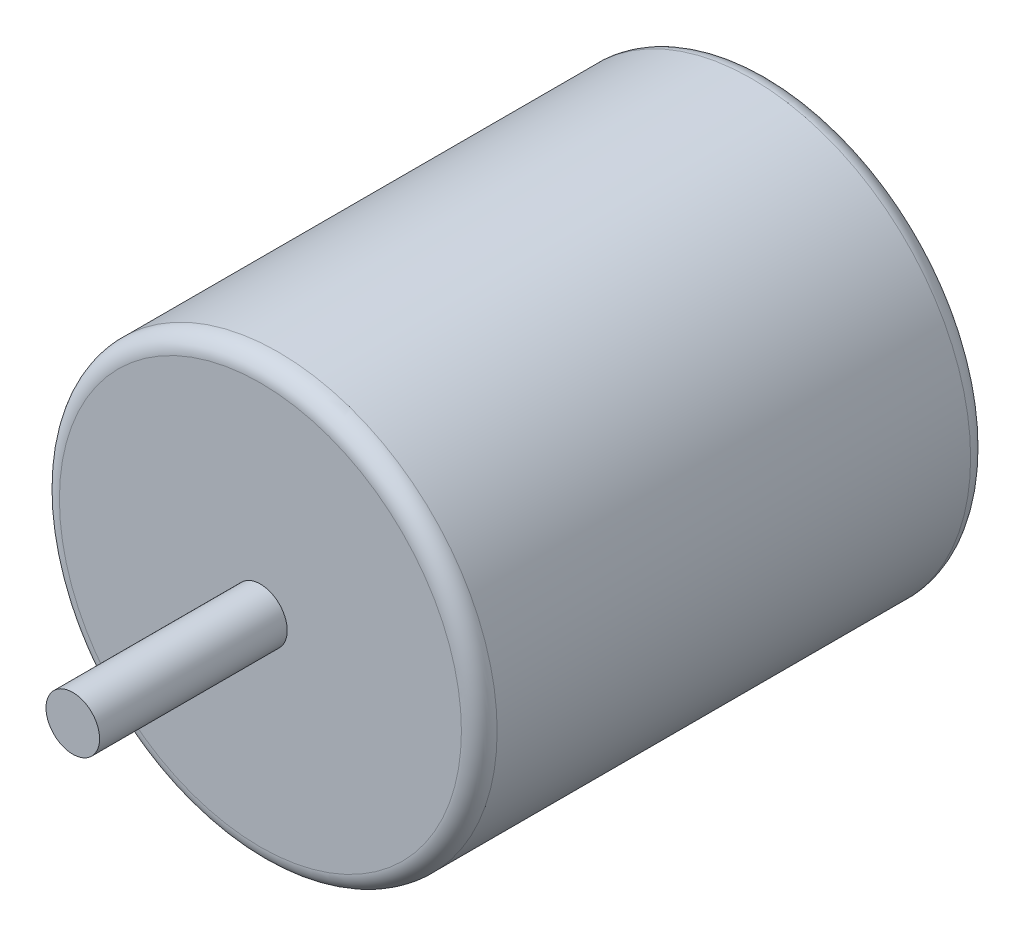
ISO-10303-21;
HEADER;
FILE_DESCRIPTION(('STEP AP214'),'2;1');
FILE_NAME('part.step','',(''),(''),'','','');
FILE_SCHEMA(('AUTOMOTIVE_DESIGN { 1 0 10303 214 1 1 1 1 }'));
ENDSEC;
DATA;
#1=APPLICATION_CONTEXT('core data for automotive mechanical design processes');
#2=APPLICATION_PROTOCOL_DEFINITION('international standard','automotive_design',2000,#1);
#3=PRODUCT_CONTEXT('',#1,'mechanical');
#4=PRODUCT('Part','Part','',(#3));
#5=PRODUCT_RELATED_PRODUCT_CATEGORY('part','',(#4));
#6=PRODUCT_DEFINITION_FORMATION('','',#4);
#7=PRODUCT_DEFINITION_CONTEXT('part definition',#1,'design');
#8=PRODUCT_DEFINITION('design','',#6,#7);
#9=PRODUCT_DEFINITION_SHAPE('','',#8);
#10=(LENGTH_UNIT() NAMED_UNIT(*) SI_UNIT(.MILLI.,.METRE.));
#11=(NAMED_UNIT(*) PLANE_ANGLE_UNIT() SI_UNIT($,.RADIAN.));
#12=(NAMED_UNIT(*) SI_UNIT($,.STERADIAN.) SOLID_ANGLE_UNIT());
#13=UNCERTAINTY_MEASURE_WITH_UNIT(LENGTH_MEASURE(1.E-05),#10,'distance_accuracy_value','');
#14=(GEOMETRIC_REPRESENTATION_CONTEXT(3) GLOBAL_UNCERTAINTY_ASSIGNED_CONTEXT((#13)) GLOBAL_UNIT_ASSIGNED_CONTEXT((#10,
#11,#12)) REPRESENTATION_CONTEXT('',''));
#15=CARTESIAN_POINT('',(0.,0.,0.));
#16=DIRECTION('',(0.,0.,1.));
#17=DIRECTION('',(1.,0.,0.));
#18=AXIS2_PLACEMENT_3D('',#15,#16,#17);
#19=CARTESIAN_POINT('',(0.,0.,57.));
#20=DIRECTION('',(0.,0.,-1.));
#21=DIRECTION('',(-1.,0.,0.));
#22=AXIS2_PLACEMENT_3D('',#19,#20,#21);
#23=CYLINDRICAL_SURFACE('',#22,24.5);
#24=CARTESIAN_POINT('',(0.,0.,55.));
#25=DIRECTION('',(0.,0.,1.));
#26=DIRECTION('',(1.,0.,0.));
#27=AXIS2_PLACEMENT_3D('',#24,#25,#26);
#28=CIRCLE('',#27,24.5);
#29=CARTESIAN_POINT('',(-24.5,0.,55.));
#30=VERTEX_POINT('',#29);
#31=EDGE_CURVE('E38',#30,#30,#28,.F.);
#32=CARTESIAN_POINT('',(0.,0.,2.));
#33=DIRECTION('',(0.,0.,1.));
#34=DIRECTION('',(1.,0.,0.));
#35=AXIS2_PLACEMENT_3D('',#32,#33,#34);
#36=CIRCLE('',#35,24.5);
#37=CARTESIAN_POINT('',(-24.5,0.,2.));
#38=VERTEX_POINT('',#37);
#39=EDGE_CURVE('E42',#38,#38,#36,.T.);
#40=CARTESIAN_POINT('',(-24.5,0.,55.));
#41=CARTESIAN_POINT('',(-24.5,0.,54.4479166666667));
#42=CARTESIAN_POINT('',(-24.5,0.,53.8958333333333));
#43=CARTESIAN_POINT('',(-24.5,0.,52.7916666666667));
#44=CARTESIAN_POINT('',(-24.5,0.,52.2395833333333));
#45=CARTESIAN_POINT('',(-24.5,0.,51.1354166666667));
#46=CARTESIAN_POINT('',(-24.5,0.,50.5833333333333));
#47=CARTESIAN_POINT('',(-24.5,0.,49.4791666666667));
#48=CARTESIAN_POINT('',(-24.5,0.,48.9270833333333));
#49=CARTESIAN_POINT('',(-24.5,0.,47.8229166666667));
#50=CARTESIAN_POINT('',(-24.5,0.,47.2708333333333));
#51=CARTESIAN_POINT('',(-24.5,0.,46.1666666666667));
#52=CARTESIAN_POINT('',(-24.5,0.,45.6145833333333));
#53=CARTESIAN_POINT('',(-24.5,0.,44.5104166666667));
#54=CARTESIAN_POINT('',(-24.5,0.,43.9583333333333));
#55=CARTESIAN_POINT('',(-24.5,0.,42.8541666666667));
#56=CARTESIAN_POINT('',(-24.5,0.,42.3020833333333));
#57=CARTESIAN_POINT('',(-24.5,0.,41.1979166666667));
#58=CARTESIAN_POINT('',(-24.5,0.,40.6458333333333));
#59=CARTESIAN_POINT('',(-24.5,0.,39.5416666666667));
#60=CARTESIAN_POINT('',(-24.5,0.,38.9895833333333));
#61=CARTESIAN_POINT('',(-24.5,0.,37.8854166666667));
#62=CARTESIAN_POINT('',(-24.5,0.,37.3333333333333));
#63=CARTESIAN_POINT('',(-24.5,0.,36.2291666666667));
#64=CARTESIAN_POINT('',(-24.5,0.,35.6770833333333));
#65=CARTESIAN_POINT('',(-24.5,0.,34.5729166666667));
#66=CARTESIAN_POINT('',(-24.5,0.,34.0208333333333));
#67=CARTESIAN_POINT('',(-24.5,0.,32.9166666666667));
#68=CARTESIAN_POINT('',(-24.5,0.,32.3645833333333));
#69=CARTESIAN_POINT('',(-24.5,0.,31.2604166666667));
#70=CARTESIAN_POINT('',(-24.5,0.,30.7083333333333));
#71=CARTESIAN_POINT('',(-24.5,0.,29.6041666666667));
#72=CARTESIAN_POINT('',(-24.5,0.,29.0520833333333));
#73=CARTESIAN_POINT('',(-24.5,0.,27.9479166666667));
#74=CARTESIAN_POINT('',(-24.5,0.,27.3958333333333));
#75=CARTESIAN_POINT('',(-24.5,0.,26.2916666666667));
#76=CARTESIAN_POINT('',(-24.5,0.,25.7395833333333));
#77=CARTESIAN_POINT('',(-24.5,0.,24.6354166666667));
#78=CARTESIAN_POINT('',(-24.5,0.,24.0833333333333));
#79=CARTESIAN_POINT('',(-24.5,0.,22.9791666666667));
#80=CARTESIAN_POINT('',(-24.5,0.,22.4270833333333));
#81=CARTESIAN_POINT('',(-24.5,0.,21.3229166666667));
#82=CARTESIAN_POINT('',(-24.5,0.,20.7708333333333));
#83=CARTESIAN_POINT('',(-24.5,0.,19.6666666666667));
#84=CARTESIAN_POINT('',(-24.5,0.,19.1145833333333));
#85=CARTESIAN_POINT('',(-24.5,0.,18.0104166666667));
#86=CARTESIAN_POINT('',(-24.5,0.,17.4583333333333));
#87=CARTESIAN_POINT('',(-24.5,0.,16.3541666666667));
#88=CARTESIAN_POINT('',(-24.5,0.,15.8020833333333));
#89=CARTESIAN_POINT('',(-24.5,0.,14.6979166666667));
#90=CARTESIAN_POINT('',(-24.5,0.,14.1458333333333));
#91=CARTESIAN_POINT('',(-24.5,0.,13.0416666666667));
#92=CARTESIAN_POINT('',(-24.5,0.,12.4895833333333));
#93=CARTESIAN_POINT('',(-24.5,0.,11.3854166666667));
#94=CARTESIAN_POINT('',(-24.5,0.,10.8333333333333));
#95=CARTESIAN_POINT('',(-24.5,0.,9.72916666666667));
#96=CARTESIAN_POINT('',(-24.5,0.,9.17708333333333));
#97=CARTESIAN_POINT('',(-24.5,0.,8.07291666666666));
#98=CARTESIAN_POINT('',(-24.5,0.,7.52083333333333));
#99=CARTESIAN_POINT('',(-24.5,0.,6.41666666666666));
#100=CARTESIAN_POINT('',(-24.5,0.,5.86458333333333));
#101=CARTESIAN_POINT('',(-24.5,0.,4.76041666666667));
#102=CARTESIAN_POINT('',(-24.5,0.,4.20833333333333));
#103=CARTESIAN_POINT('',(-24.5,0.,3.10416666666667));
#104=CARTESIAN_POINT('',(-24.5,0.,2.55208333333333));
#105=CARTESIAN_POINT('',(-24.5,0.,2.));
#106=B_SPLINE_CURVE_WITH_KNOTS('',3,(#40,#41,#42,#43,#44,#45,#46,#47,#48,#49,#50,#51,#52,#53,
#54,#55,#56,#57,#58,#59,#60,#61,#62,#63,#64,#65,#66,#67,#68,#69,#70,#71,#72,#73,#74,#75,#76,#77,
#78,#79,#80,#81,#82,#83,#84,#85,#86,#87,#88,#89,#90,#91,#92,#93,#94,#95,#96,#97,#98,#99,#100,
#101,#102,#103,#104,#105),.UNSPECIFIED.,.F.,.F.,(4,2,2,2,2,2,2,2,2,2,2,2,2,2,2,2,2,2,2,2,2,2,2,
2,2,2,2,2,2,2,2,2,4),(0.,1.65625,3.3125,4.96875,6.625,8.28125,9.9375,11.59375,13.25,14.90625,
16.5625,18.21875,19.875,21.53125,23.1875,24.84375,26.5,28.15625,29.8125,31.46875,33.125,
34.78125,36.4375,38.09375,39.75,41.40625,43.0625,44.71875,46.375,48.03125,49.6875,51.34375,53.),.UNSPECIFIED.);
#107=EDGE_CURVE('BSEAM31',#30,#38,#106,.T.);
#108=ORIENTED_EDGE('',*,*,#31,.T.);
#109=ORIENTED_EDGE('',*,*,#39,.T.);
#110=ORIENTED_EDGE('',*,*,#107,.T.);
#111=ORIENTED_EDGE('',*,*,#107,.F.);
#112=EDGE_LOOP('',(#108,#110,#109,#111));
#113=FACE_BOUND('',#112,.T.);
#114=ADVANCED_FACE('F31',(#113),#23,.T.);
#115=CARTESIAN_POINT('',(0.,0.,57.));
#116=DIRECTION('',(0.,0.,1.));
#117=DIRECTION('',(1.,0.,0.));
#118=AXIS2_PLACEMENT_3D('',#115,#116,#117);
#119=PLANE('',#118);
#120=CARTESIAN_POINT('',(0.,0.,57.));
#121=DIRECTION('',(0.,0.,1.));
#122=DIRECTION('',(1.,0.,0.));
#123=AXIS2_PLACEMENT_3D('',#120,#121,#122);
#124=CIRCLE('',#123,22.5);
#125=CARTESIAN_POINT('',(22.5,0.,57.));
#126=VERTEX_POINT('',#125);
#127=EDGE_CURVE('E46',#126,#126,#124,.T.);
#128=ORIENTED_EDGE('',*,*,#127,.T.);
#129=EDGE_LOOP('',(#128));
#130=FACE_BOUND('',#129,.T.);
#131=CARTESIAN_POINT('',(0.,0.,57.));
#132=DIRECTION('',(0.,0.,1.));
#133=DIRECTION('',(1.,0.,0.));
#134=AXIS2_PLACEMENT_3D('',#131,#132,#133);
#135=CIRCLE('',#134,3.);
#136=CARTESIAN_POINT('',(-3.,0.,57.));
#137=VERTEX_POINT('',#136);
#138=EDGE_CURVE('E52',#137,#137,#135,.T.);
#139=ORIENTED_EDGE('',*,*,#138,.F.);
#140=EDGE_LOOP('',(#139));
#141=FACE_BOUND('',#140,.T.);
#142=ADVANCED_FACE('F67',(#130,#141),#119,.T.);
#143=CARTESIAN_POINT('',(0.,0.,0.));
#144=DIRECTION('',(0.,0.,1.));
#145=DIRECTION('',(1.,0.,0.));
#146=AXIS2_PLACEMENT_3D('',#143,#144,#145);
#147=PLANE('',#146);
#148=CARTESIAN_POINT('',(0.,0.,0.));
#149=DIRECTION('',(0.,0.,1.));
#150=DIRECTION('',(1.,0.,0.));
#151=AXIS2_PLACEMENT_3D('',#148,#149,#150);
#152=CIRCLE('',#151,22.5);
#153=CARTESIAN_POINT('',(22.5,0.,0.));
#154=VERTEX_POINT('',#153);
#155=EDGE_CURVE('E10',#154,#154,#152,.F.);
#156=ORIENTED_EDGE('',*,*,#155,.T.);
#157=EDGE_LOOP('',(#156));
#158=FACE_BOUND('',#157,.T.);
#159=ADVANCED_FACE('F63',(#158),#147,.F.);
#160=CARTESIAN_POINT('',(0.,0.,78.));
#161=DIRECTION('',(0.,0.,-1.));
#162=DIRECTION('',(-1.,0.,0.));
#163=AXIS2_PLACEMENT_3D('',#160,#161,#162);
#164=CYLINDRICAL_SURFACE('',#163,3.);
#165=CARTESIAN_POINT('',(0.,0.,78.));
#166=DIRECTION('',(0.,0.,1.));
#167=DIRECTION('',(1.,0.,0.));
#168=AXIS2_PLACEMENT_3D('',#165,#166,#167);
#169=CIRCLE('',#168,3.);
#170=CARTESIAN_POINT('',(-3.,0.,78.));
#171=VERTEX_POINT('',#170);
#172=EDGE_CURVE('E51',#171,#171,#169,.T.);
#173=CARTESIAN_POINT('',(-3.,0.,78.));
#174=CARTESIAN_POINT('',(-3.,0.,77.78125));
#175=CARTESIAN_POINT('',(-3.,0.,77.5625));
#176=CARTESIAN_POINT('',(-3.,0.,77.125));
#177=CARTESIAN_POINT('',(-3.,0.,76.90625));
#178=CARTESIAN_POINT('',(-3.,0.,76.46875));
#179=CARTESIAN_POINT('',(-3.,0.,76.25));
#180=CARTESIAN_POINT('',(-3.,0.,75.8125));
#181=CARTESIAN_POINT('',(-3.,0.,75.59375));
#182=CARTESIAN_POINT('',(-3.,0.,75.15625));
#183=CARTESIAN_POINT('',(-3.,0.,74.9375));
#184=CARTESIAN_POINT('',(-3.,0.,74.5));
#185=CARTESIAN_POINT('',(-3.,0.,74.28125));
#186=CARTESIAN_POINT('',(-3.,0.,73.84375));
#187=CARTESIAN_POINT('',(-3.,0.,73.625));
#188=CARTESIAN_POINT('',(-3.,0.,73.1875));
#189=CARTESIAN_POINT('',(-3.,0.,72.96875));
#190=CARTESIAN_POINT('',(-3.,0.,72.53125));
#191=CARTESIAN_POINT('',(-3.,0.,72.3125));
#192=CARTESIAN_POINT('',(-3.,0.,71.875));
#193=CARTESIAN_POINT('',(-3.,0.,71.65625));
#194=CARTESIAN_POINT('',(-3.,0.,71.21875));
#195=CARTESIAN_POINT('',(-3.,0.,71.));
#196=CARTESIAN_POINT('',(-3.,0.,70.5625));
#197=CARTESIAN_POINT('',(-3.,0.,70.34375));
#198=CARTESIAN_POINT('',(-3.,0.,69.90625));
#199=CARTESIAN_POINT('',(-3.,0.,69.6875));
#200=CARTESIAN_POINT('',(-3.,0.,69.25));
#201=CARTESIAN_POINT('',(-3.,0.,69.03125));
#202=CARTESIAN_POINT('',(-3.,0.,68.59375));
#203=CARTESIAN_POINT('',(-3.,0.,68.375));
#204=CARTESIAN_POINT('',(-3.,0.,67.9375));
#205=CARTESIAN_POINT('',(-3.,0.,67.71875));
#206=CARTESIAN_POINT('',(-3.,0.,67.28125));
#207=CARTESIAN_POINT('',(-3.,0.,67.0625));
#208=CARTESIAN_POINT('',(-3.,0.,66.625));
#209=CARTESIAN_POINT('',(-3.,0.,66.40625));
#210=CARTESIAN_POINT('',(-3.,0.,65.96875));
#211=CARTESIAN_POINT('',(-3.,0.,65.75));
#212=CARTESIAN_POINT('',(-3.,0.,65.3125));
#213=CARTESIAN_POINT('',(-3.,0.,65.09375));
#214=CARTESIAN_POINT('',(-3.,0.,64.65625));
#215=CARTESIAN_POINT('',(-3.,0.,64.4375));
#216=CARTESIAN_POINT('',(-3.,0.,64.));
#217=CARTESIAN_POINT('',(-3.,0.,63.78125));
#218=CARTESIAN_POINT('',(-3.,0.,63.34375));
#219=CARTESIAN_POINT('',(-3.,0.,63.125));
#220=CARTESIAN_POINT('',(-3.,0.,62.6875));
#221=CARTESIAN_POINT('',(-3.,0.,62.46875));
#222=CARTESIAN_POINT('',(-3.,0.,62.03125));
#223=CARTESIAN_POINT('',(-3.,0.,61.8125));
#224=CARTESIAN_POINT('',(-3.,0.,61.375));
#225=CARTESIAN_POINT('',(-3.,0.,61.15625));
#226=CARTESIAN_POINT('',(-3.,0.,60.71875));
#227=CARTESIAN_POINT('',(-3.,0.,60.5));
#228=CARTESIAN_POINT('',(-3.,0.,60.0625));
#229=CARTESIAN_POINT('',(-3.,0.,59.84375));
#230=CARTESIAN_POINT('',(-3.,0.,59.40625));
#231=CARTESIAN_POINT('',(-3.,0.,59.1875));
#232=CARTESIAN_POINT('',(-3.,0.,58.75));
#233=CARTESIAN_POINT('',(-3.,0.,58.53125));
#234=CARTESIAN_POINT('',(-3.,0.,58.09375));
#235=CARTESIAN_POINT('',(-3.,0.,57.875));
#236=CARTESIAN_POINT('',(-3.,0.,57.4375));
#237=CARTESIAN_POINT('',(-3.,0.,57.21875));
#238=CARTESIAN_POINT('',(-3.,0.,57.));
#239=B_SPLINE_CURVE_WITH_KNOTS('',3,(#173,#174,#175,#176,#177,#178,#179,#180,#181,#182,#183,
#184,#185,#186,#187,#188,#189,#190,#191,#192,#193,#194,#195,#196,#197,#198,#199,#200,#201,#202,
#203,#204,#205,#206,#207,#208,#209,#210,#211,#212,#213,#214,#215,#216,#217,#218,#219,#220,#221,
#222,#223,#224,#225,#226,#227,#228,#229,#230,#231,#232,#233,#234,#235,#236,#237,#238),
.UNSPECIFIED.,.F.,.F.,(4,2,2,2,2,2,2,2,2,2,2,2,2,2,2,2,2,2,2,2,2,2,2,2,2,2,2,2,2,2,2,2,4),(0.,
0.656249999999997,1.31249999999999,1.96874999999999,2.62499999999999,3.28124999999999,3.9375,
4.59374999999999,5.24999999999999,5.90624999999999,6.56249999999998,7.21875,7.87499999999999,
8.53124999999999,9.18749999999999,9.84374999999998,10.5,11.15625,11.8125,12.46875,13.125,
13.78125,14.4375,15.09375,15.75,16.40625,17.0625,17.71875,18.375,19.03125,19.6875,20.34375,21.),.UNSPECIFIED.);
#240=EDGE_CURVE('BSEAM60',#171,#137,#239,.T.);
#241=ORIENTED_EDGE('',*,*,#172,.F.);
#242=ORIENTED_EDGE('',*,*,#138,.T.);
#243=ORIENTED_EDGE('',*,*,#240,.T.);
#244=ORIENTED_EDGE('',*,*,#240,.F.);
#245=EDGE_LOOP('',(#241,#243,#242,#244));
#246=FACE_BOUND('',#245,.T.);
#247=ADVANCED_FACE('F60',(#246),#164,.T.);
#248=CARTESIAN_POINT('',(0.,0.,78.));
#249=DIRECTION('',(0.,0.,1.));
#250=DIRECTION('',(1.,0.,0.));
#251=AXIS2_PLACEMENT_3D('',#248,#249,#250);
#252=PLANE('',#251);
#253=ORIENTED_EDGE('',*,*,#172,.T.);
#254=EDGE_LOOP('',(#253));
#255=FACE_BOUND('',#254,.T.);
#256=ADVANCED_FACE('F58',(#255),#252,.T.);
#257=CARTESIAN_POINT('',(0.,0.,55.));
#258=DIRECTION('',(0.,0.,1.));
#259=DIRECTION('',(1.,0.,0.));
#260=AXIS2_PLACEMENT_3D('',#257,#258,#259);
#261=TOROIDAL_SURFACE('',#260,22.5,2.);
#262=ORIENTED_EDGE('',*,*,#31,.F.);
#263=EDGE_LOOP('',(#262));
#264=FACE_BOUND('',#263,.T.);
#265=ORIENTED_EDGE('',*,*,#127,.F.);
#266=EDGE_LOOP('',(#265));
#267=FACE_BOUND('',#266,.T.);
#268=ADVANCED_FACE('F78',(#264,#267),#261,.T.);
#269=CARTESIAN_POINT('',(0.,0.,2.));
#270=DIRECTION('',(0.,0.,1.));
#271=DIRECTION('',(1.,0.,0.));
#272=AXIS2_PLACEMENT_3D('',#269,#270,#271);
#273=TOROIDAL_SURFACE('',#272,22.5,2.);
#274=ORIENTED_EDGE('',*,*,#155,.F.);
#275=EDGE_LOOP('',(#274));
#276=FACE_BOUND('',#275,.T.);
#277=ORIENTED_EDGE('',*,*,#39,.F.);
#278=EDGE_LOOP('',(#277));
#279=FACE_BOUND('',#278,.T.);
#280=ADVANCED_FACE('F33',(#276,#279),#273,.T.);
#281=CLOSED_SHELL('',(#114,#142,#159,#247,#256,#268,#280));
#282=MANIFOLD_SOLID_BREP('B2',#281);
#283=ADVANCED_BREP_SHAPE_REPRESENTATION('',(#18,#282),#14);
#284=SHAPE_DEFINITION_REPRESENTATION(#9,#283);
ENDSEC;
END-ISO-10303-21;
